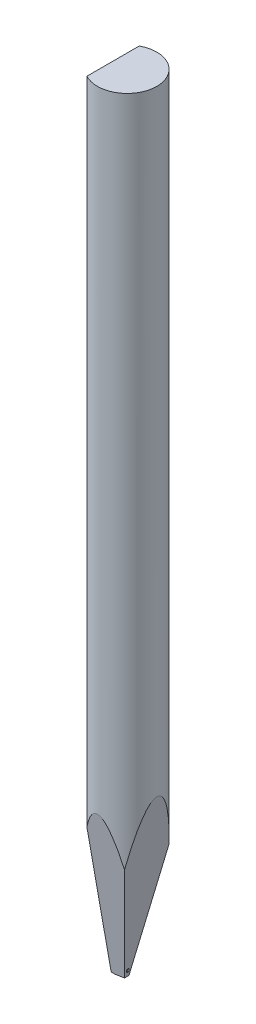
ISO-10303-21;
HEADER;
FILE_DESCRIPTION(('STEP AP214'),'2;1');
FILE_NAME('part.step','',(''),(''),'','','');
FILE_SCHEMA(('AUTOMOTIVE_DESIGN { 1 0 10303 214 1 1 1 1 }'));
ENDSEC;
DATA;
#1=APPLICATION_CONTEXT('core data for automotive mechanical design processes');
#2=APPLICATION_PROTOCOL_DEFINITION('international standard','automotive_design',2000,#1);
#3=PRODUCT_CONTEXT('',#1,'mechanical');
#4=PRODUCT('Part','Part','',(#3));
#5=PRODUCT_RELATED_PRODUCT_CATEGORY('part','',(#4));
#6=PRODUCT_DEFINITION_FORMATION('','',#4);
#7=PRODUCT_DEFINITION_CONTEXT('part definition',#1,'design');
#8=PRODUCT_DEFINITION('design','',#6,#7);
#9=PRODUCT_DEFINITION_SHAPE('','',#8);
#10=(LENGTH_UNIT() NAMED_UNIT(*) SI_UNIT(.MILLI.,.METRE.));
#11=(NAMED_UNIT(*) PLANE_ANGLE_UNIT() SI_UNIT($,.RADIAN.));
#12=(NAMED_UNIT(*) SI_UNIT($,.STERADIAN.) SOLID_ANGLE_UNIT());
#13=UNCERTAINTY_MEASURE_WITH_UNIT(LENGTH_MEASURE(1.E-05),#10,'distance_accuracy_value','');
#14=(GEOMETRIC_REPRESENTATION_CONTEXT(3) GLOBAL_UNCERTAINTY_ASSIGNED_CONTEXT((#13)) GLOBAL_UNIT_ASSIGNED_CONTEXT((#10,
#11,#12)) REPRESENTATION_CONTEXT('',''));
#15=CARTESIAN_POINT('',(0.,0.,0.));
#16=DIRECTION('',(0.,0.,1.));
#17=DIRECTION('',(1.,0.,0.));
#18=AXIS2_PLACEMENT_3D('',#15,#16,#17);
#19=CARTESIAN_POINT('',(26.8738719491216,0.,0.0508));
#20=DIRECTION('',(0.,-0.173648177666931,0.984807753012208));
#21=DIRECTION('',(0.,-0.984807753012208,-0.173648177666931));
#22=AXIS2_PLACEMENT_3D('',#19,#20,#21);
#23=PLANE('',#22);
#24=CARTESIAN_POINT('',(-0.34798,0.02794,0.0557265758409954));
#25=DIRECTION('',(0.,-0.173648177666931,0.984807753012208));
#26=DIRECTION('',(0.,-0.984807753012208,-0.173648177666931));
#27=AXIS2_PLACEMENT_3D('',#24,#25,#26);
#28=ELLIPSE('',#27,0.0283710195360877,0.02794);
#29=CARTESIAN_POINT('',(-0.34798,0.,0.0508000000000009));
#30=VERTEX_POINT('',#29);
#31=CARTESIAN_POINT('',(-0.37592,0.02794,0.0557265758409954));
#32=VERTEX_POINT('',#31);
#33=EDGE_CURVE('E78',#30,#32,#28,.F.);
#34=ORIENTED_EDGE('',*,*,#33,.F.);
#35=DIRECTION('',(-1.,0.,0.));
#36=VECTOR('',#35,1.);
#37=CARTESIAN_POINT('',(26.8738719491216,0.,0.0508));
#38=LINE('',#37,#36);
#39=CARTESIAN_POINT('',(-0.287019999999997,0.,0.0508));
#40=VERTEX_POINT('',#39);
#41=EDGE_CURVE('E485',#40,#30,#38,.T.);
#42=ORIENTED_EDGE('',*,*,#41,.F.);
#43=DIRECTION('',(-0.984346441568213,-0.173566836012845,-0.0306045161452665));
#44=VECTOR('',#43,1.);
#45=CARTESIAN_POINT('',(26.0301980698046,4.64043560289492,0.869033999030531));
#46=LINE('',#45,#44);
#47=CARTESIAN_POINT('',(-0.0117618940403387,0.0485354307393987,0.0593581059596632));
#48=VERTEX_POINT('',#47);
#49=EDGE_CURVE('E406',#48,#40,#46,.T.);
#50=ORIENTED_EDGE('',*,*,#49,.F.);
#51=DIRECTION('',(-0.171087869746036,-0.970287525247814,-0.171087869746036));
#52=VECTOR('',#51,1.);
#53=CARTESIAN_POINT('',(0.766901483986011,4.46455489014234,0.838021483986016));
#54=LINE('',#53,#52);
#55=CARTESIAN_POINT('',(0.523678555180163,3.08516911589156,0.594798555180167));
#56=VERTEX_POINT('',#55);
#57=EDGE_CURVE('E487',#56,#48,#54,.T.);
#58=ORIENTED_EDGE('',*,*,#57,.F.);
#59=CARTESIAN_POINT('',(0.,-0.288101116436578,0.));
#60=DIRECTION('',(0.,-0.173648177666931,0.984807753012208));
#61=DIRECTION('',(0.,-0.984807753012208,-0.173648177666931));
#62=AXIS2_PLACEMENT_3D('',#59,#60,#61);
#63=ELLIPSE('',#62,4.56371043248163,0.792479999999998);
#64=CARTESIAN_POINT('',(-0.37592,3.66844093071415,0.69764511322018));
#65=VERTEX_POINT('',#64);
#66=EDGE_CURVE('E480',#56,#65,#63,.T.);
#67=ORIENTED_EDGE('',*,*,#66,.T.);
#68=DIRECTION('',(0.,0.984807753012208,0.173648177666931));
#69=VECTOR('',#68,1.);
#70=CARTESIAN_POINT('',(-0.37592,20.251112252608,3.62161747949059));
#71=LINE('',#70,#69);
#72=EDGE_CURVE('E467',#32,#65,#71,.T.);
#73=ORIENTED_EDGE('',*,*,#72,.F.);
#74=EDGE_LOOP('',(#34,#42,#50,#58,#67,#73));
#75=FACE_BOUND('',#74,.T.);
#76=ADVANCED_FACE('F46',(#75),#23,.T.);
#77=CARTESIAN_POINT('',(26.8738719491216,0.,-0.0508));
#78=DIRECTION('',(0.,-0.173648177666931,-0.984807753012208));
#79=DIRECTION('',(0.,0.984807753012208,-0.173648177666931));
#80=AXIS2_PLACEMENT_3D('',#77,#78,#79);
#81=PLANE('',#80);
#82=CARTESIAN_POINT('',(-0.34798,0.02794,-0.0557265758409954));
#83=DIRECTION('',(0.,-0.173648177666931,-0.984807753012208));
#84=DIRECTION('',(0.,0.984807753012208,-0.173648177666931));
#85=AXIS2_PLACEMENT_3D('',#82,#83,#84);
#86=ELLIPSE('',#85,0.0283710195360877,0.02794);
#87=CARTESIAN_POINT('',(-0.37592,0.02794,-0.0557265758409954));
#88=VERTEX_POINT('',#87);
#89=CARTESIAN_POINT('',(-0.34798,0.,-0.0508000000000009));
#90=VERTEX_POINT('',#89);
#91=EDGE_CURVE('E444',#88,#90,#86,.F.);
#92=ORIENTED_EDGE('',*,*,#91,.F.);
#93=DIRECTION('',(0.,-0.984807753012208,0.173648177666931));
#94=VECTOR('',#93,1.);
#95=CARTESIAN_POINT('',(-0.37592,20.5255765703836,-3.67001294395617));
#96=LINE('',#95,#94);
#97=CARTESIAN_POINT('',(-0.37592,3.66844093071414,-0.69764511322018));
#98=VERTEX_POINT('',#97);
#99=EDGE_CURVE('E368',#98,#88,#96,.T.);
#100=ORIENTED_EDGE('',*,*,#99,.F.);
#101=CARTESIAN_POINT('',(0.,-0.288101116436578,0.));
#102=DIRECTION('',(0.,-0.173648177666931,-0.984807753012208));
#103=DIRECTION('',(0.,-0.984807753012208,0.173648177666931));
#104=AXIS2_PLACEMENT_3D('',#101,#102,#103);
#105=ELLIPSE('',#104,4.56371043248163,0.792479999999998);
#106=CARTESIAN_POINT('',(0.523678555180163,3.08516911589156,-0.594798555180167));
#107=VERTEX_POINT('',#106);
#108=EDGE_CURVE('E478',#98,#107,#105,.T.);
#109=ORIENTED_EDGE('',*,*,#108,.T.);
#110=DIRECTION('',(0.171087869746036,0.970287525247814,-0.171087869746036));
#111=VECTOR('',#110,1.);
#112=CARTESIAN_POINT('',(0.766901483986011,4.46455489014234,-0.838021483986016));
#113=LINE('',#112,#111);
#114=CARTESIAN_POINT('',(-0.0117618940403387,0.0485354307393987,-0.0593581059596632));
#115=VERTEX_POINT('',#114);
#116=EDGE_CURVE('E362',#115,#107,#113,.T.);
#117=ORIENTED_EDGE('',*,*,#116,.F.);
#118=DIRECTION('',(0.984346441568213,0.173566836012845,-0.0306045161452665));
#119=VECTOR('',#118,1.);
#120=CARTESIAN_POINT('',(26.0301980698046,4.64043560289492,-0.869033999030531));
#121=LINE('',#120,#119);
#122=CARTESIAN_POINT('',(-0.287019999999997,0.,-0.0508));
#123=VERTEX_POINT('',#122);
#124=EDGE_CURVE('E359',#123,#115,#121,.T.);
#125=ORIENTED_EDGE('',*,*,#124,.F.);
#126=DIRECTION('',(-1.,0.,0.));
#127=VECTOR('',#126,1.);
#128=CARTESIAN_POINT('',(26.8738719491216,0.,-0.0508));
#129=LINE('',#128,#127);
#130=EDGE_CURVE('E483',#123,#90,#129,.T.);
#131=ORIENTED_EDGE('',*,*,#130,.T.);
#132=EDGE_LOOP('',(#92,#100,#109,#117,#125,#131));
#133=FACE_BOUND('',#132,.T.);
#134=ADVANCED_FACE('F495',(#133),#81,.T.);
#135=CARTESIAN_POINT('',(0.,0.,0.));
#136=DIRECTION('',(0.,1.,0.));
#137=DIRECTION('',(0.,0.,1.));
#138=AXIS2_PLACEMENT_3D('',#135,#136,#137);
#139=PLANE('',#138);
#140=ORIENTED_EDGE('',*,*,#41,.T.);
#141=DIRECTION('',(0.,0.,-1.));
#142=VECTOR('',#141,1.);
#143=CARTESIAN_POINT('',(-0.34798,0.,26.4742862357989));
#144=LINE('',#143,#142);
#145=CARTESIAN_POINT('',(-0.347980000000001,0.,0.0279445807869608));
#146=VERTEX_POINT('',#145);
#147=EDGE_CURVE('E191',#30,#146,#144,.T.);
#148=ORIENTED_EDGE('',*,*,#147,.T.);
#149=DIRECTION('',(-1.,0.,0.));
#150=VECTOR('',#149,1.);
#151=CARTESIAN_POINT('',(26.7627469491216,0.,0.0279445807869608));
#152=LINE('',#151,#150);
#153=CARTESIAN_POINT('',(-0.287346115943936,0.000172120518164335,0.027187177847314));
#154=VERTEX_POINT('',#153);
#155=EDGE_CURVE('E188',#154,#146,#152,.T.);
#156=ORIENTED_EDGE('',*,*,#155,.F.);
#157=DIRECTION('',(0.,0.,-1.));
#158=VECTOR('',#157,1.);
#159=CARTESIAN_POINT('',(-0.28702,0.,27.2760283406468));
#160=LINE('',#159,#158);
#161=EDGE_CURVE('E391',#40,#154,#160,.T.);
#162=ORIENTED_EDGE('',*,*,#161,.F.);
#163=EDGE_LOOP('',(#140,#148,#156,#162));
#164=FACE_BOUND('',#163,.T.);
#165=ADVANCED_FACE('F404',(#164),#139,.F.);
#166=DIRECTION('',(-1.,0.,0.));
#167=VECTOR('',#166,1.);
#168=CARTESIAN_POINT('',(26.7627469491216,0.,-0.0279445807869607));
#169=LINE('',#168,#167);
#170=CARTESIAN_POINT('',(-0.287344442826813,0.000170388616115332,-0.0271950816037738));
#171=VERTEX_POINT('',#170);
#172=CARTESIAN_POINT('',(-0.347980000000001,0.,-0.0279445807869607));
#173=VERTEX_POINT('',#172);
#174=EDGE_CURVE('E382',#171,#173,#169,.T.);
#175=ORIENTED_EDGE('',*,*,#174,.T.);
#176=EDGE_CURVE('E451',#173,#90,#144,.T.);
#177=ORIENTED_EDGE('',*,*,#176,.T.);
#178=ORIENTED_EDGE('',*,*,#130,.F.);
#179=EDGE_CURVE('E388',#171,#123,#160,.T.);
#180=ORIENTED_EDGE('',*,*,#179,.F.);
#181=EDGE_LOOP('',(#175,#177,#178,#180));
#182=FACE_BOUND('',#181,.T.);
#183=ADVANCED_FACE('F449',(#182),#139,.F.);
#184=CARTESIAN_POINT('',(0.,21.0312,0.));
#185=DIRECTION('',(0.,-1.,0.));
#186=DIRECTION('',(0.,0.,-1.));
#187=AXIS2_PLACEMENT_3D('',#184,#185,#186);
#188=CYLINDRICAL_SURFACE('',#187,0.792479999999998);
#189=ORIENTED_EDGE('',*,*,#66,.F.);
#190=CARTESIAN_POINT('',(0.,0.115240446574634,0.));
#191=DIRECTION('',(-0.984807753012208,0.173648177666931,0.));
#192=DIRECTION('',(-0.173648177666931,-0.984807753012208,0.));
#193=AXIS2_PLACEMENT_3D('',#190,#191,#192);
#194=ELLIPSE('',#193,4.56371043248165,0.792479999999998);
#195=EDGE_CURVE('E397',#56,#107,#194,.T.);
#196=ORIENTED_EDGE('',*,*,#195,.T.);
#197=ORIENTED_EDGE('',*,*,#108,.F.);
#198=DIRECTION('',(0.,-1.,0.));
#199=VECTOR('',#198,1.);
#200=CARTESIAN_POINT('',(-0.37592,21.0312,-0.69764511322018));
#201=LINE('',#200,#199);
#202=CARTESIAN_POINT('',(-0.37592,21.0312,-0.69764511322018));
#203=VERTEX_POINT('',#202);
#204=EDGE_CURVE('E464',#203,#98,#201,.T.);
#205=ORIENTED_EDGE('',*,*,#204,.F.);
#206=CARTESIAN_POINT('',(0.,21.0312,0.));
#207=DIRECTION('',(0.,1.,0.));
#208=DIRECTION('',(0.,0.,1.));
#209=AXIS2_PLACEMENT_3D('',#206,#207,#208);
#210=CIRCLE('',#209,0.792479999999998);
#211=CARTESIAN_POINT('',(-0.37592,21.0312,0.69764511322018));
#212=VERTEX_POINT('',#211);
#213=EDGE_CURVE('E468',#212,#203,#210,.T.);
#214=ORIENTED_EDGE('',*,*,#213,.F.);
#215=DIRECTION('',(0.,-1.,0.));
#216=VECTOR('',#215,1.);
#217=CARTESIAN_POINT('',(-0.37592,21.0312,0.69764511322018));
#218=LINE('',#217,#216);
#219=EDGE_CURVE('E474',#65,#212,#218,.F.);
#220=ORIENTED_EDGE('',*,*,#219,.F.);
#221=EDGE_LOOP('',(#189,#196,#197,#205,#214,#220));
#222=FACE_BOUND('',#221,.T.);
#223=ADVANCED_FACE('F306',(#222),#188,.T.);
#224=CARTESIAN_POINT('',(-0.37592,21.0312,-0.80247998));
#225=DIRECTION('',(-1.,0.,0.));
#226=DIRECTION('',(0.,0.,1.));
#227=AXIS2_PLACEMENT_3D('',#224,#225,#226);
#228=PLANE('',#227);
#229=DIRECTION('',(0.,0.,-1.));
#230=VECTOR('',#229,1.);
#231=CARTESIAN_POINT('',(-0.37592,0.02794,26.4742862357989));
#232=LINE('',#231,#230);
#233=CARTESIAN_POINT('',(-0.37592,0.0279425976419618,0.000819623696634939));
#234=VERTEX_POINT('',#233);
#235=EDGE_CURVE('E71',#32,#234,#232,.T.);
#236=ORIENTED_EDGE('',*,*,#235,.F.);
#237=ORIENTED_EDGE('',*,*,#72,.T.);
#238=ORIENTED_EDGE('',*,*,#219,.T.);
#239=DIRECTION('',(0.,0.,-1.));
#240=VECTOR('',#239,1.);
#241=CARTESIAN_POINT('',(-0.37592,21.0312,-0.80247998));
#242=LINE('',#241,#240);
#243=EDGE_CURVE('E476',#212,#203,#242,.T.);
#244=ORIENTED_EDGE('',*,*,#243,.T.);
#245=ORIENTED_EDGE('',*,*,#204,.T.);
#246=ORIENTED_EDGE('',*,*,#99,.T.);
#247=EDGE_CURVE('E454',#234,#88,#232,.T.);
#248=ORIENTED_EDGE('',*,*,#247,.F.);
#249=EDGE_LOOP('',(#236,#237,#238,#244,#245,#246,#248));
#250=FACE_BOUND('',#249,.T.);
#251=ADVANCED_FACE('F461',(#250),#228,.T.);
#252=CARTESIAN_POINT('',(0.,21.0312,0.));
#253=DIRECTION('',(0.,1.,0.));
#254=DIRECTION('',(0.,0.,1.));
#255=AXIS2_PLACEMENT_3D('',#252,#253,#254);
#256=PLANE('',#255);
#257=ORIENTED_EDGE('',*,*,#213,.T.);
#258=ORIENTED_EDGE('',*,*,#243,.F.);
#259=EDGE_LOOP('',(#257,#258));
#260=FACE_BOUND('',#259,.T.);
#261=ADVANCED_FACE('F268',(#260),#256,.T.);
#262=CARTESIAN_POINT('',(-0.28702,0.,27.2760283406468));
#263=DIRECTION('',(-0.173648177666931,0.984807753012208,0.));
#264=DIRECTION('',(-0.984807753012208,-0.173648177666931,0.));
#265=AXIS2_PLACEMENT_3D('',#262,#263,#264);
#266=PLANE('',#265);
#267=CARTESIAN_POINT('',(-0.283960077964881,0.0005395468136565,0.0253794004304087));
#268=CARTESIAN_POINT('',(-0.290959888306957,-0.000403878190724749,0.0301014513274831));
#269=CARTESIAN_POINT('',(-0.301183512125918,-0.000354477550686594,0.029931369963511));
#270=CARTESIAN_POINT('',(-0.318739741346951,0.00159087096165506,0.0200336604158991));
#271=CARTESIAN_POINT('',(-0.325348851695025,0.0030571005873994,0.0101243519931192));
#272=CARTESIAN_POINT('',(-0.325298447967635,0.00304290082609972,-0.0103044348000937));
#273=CARTESIAN_POINT('',(-0.318650802822014,0.00156884374670576,-0.0201631568321128));
#274=CARTESIAN_POINT('',(-0.301094902380228,-0.000366386528997244,-0.0299742282026066));
#275=CARTESIAN_POINT('',(-0.290914989366692,-0.000402303153274816,-0.0300935679165402));
#276=CARTESIAN_POINT('',(-0.283960077964888,0.000539546813656544,-0.0253794004304084));
#277=(BOUNDED_CURVE() B_SPLINE_CURVE(3,(#267,#268,#269,#270,#271,#272,#273,#274,#275,#276),
.UNSPECIFIED.,.F.,.F.) B_SPLINE_CURVE_WITH_KNOTS((4,2,2,2,4),(1.16654008179031E-06,
2.15136488565191E-05,4.18607576312478E-05,6.22078664059766E-05,8.25549751807053E-05),
.UNSPECIFIED.) CURVE() GEOMETRIC_REPRESENTATION_ITEM() RATIONAL_B_SPLINE_CURVE((1.,1.,1.,1.,1.,
1.,1.,1.,1.,1.)) REPRESENTATION_ITEM(''));
#278=CARTESIAN_POINT('',(-0.283960077964881,0.00053954681365645,0.0253794004304088));
#279=VERTEX_POINT('',#278);
#280=EDGE_CURVE('E285',#154,#279,#277,.F.);
#281=ORIENTED_EDGE('',*,*,#280,.T.);
#282=CARTESIAN_POINT('',(-0.282645245708626,0.000771387215539414,0.));
#283=DIRECTION('',(-0.173648177666931,0.984807753012208,0.));
#284=DIRECTION('',(-0.984807753012208,-0.173648177666931,0.));
#285=AXIS2_PLACEMENT_3D('',#282,#283,#284);
#286=ELLIPSE('',#285,0.0331573451490401,0.0254);
#287=CARTESIAN_POINT('',(-0.282645245708626,0.000771387215539388,0.0253999999999992));
#288=VERTEX_POINT('',#287);
#289=EDGE_CURVE('E375',#279,#288,#286,.T.);
#290=ORIENTED_EDGE('',*,*,#289,.T.);
#291=DIRECTION('',(-0.984807753012208,-0.173648177666931,0.));
#292=VECTOR('',#291,1.);
#293=CARTESIAN_POINT('',(-0.28702,0.,0.0253999999999983));
#294=LINE('',#293,#292);
#295=CARTESIAN_POINT('',(-0.13462,0.0268722318599702,0.0253999999999992));
#296=VERTEX_POINT('',#295);
#297=EDGE_CURVE('E380',#296,#288,#294,.T.);
#298=ORIENTED_EDGE('',*,*,#297,.F.);
#299=DIRECTION('',(0.,0.,1.));
#300=VECTOR('',#299,1.);
#301=CARTESIAN_POINT('',(-0.13462,0.0268722318599702,27.2760283406468));
#302=LINE('',#301,#300);
#303=CARTESIAN_POINT('',(-0.13462,0.0268722318599702,-0.0253999999999992));
#304=VERTEX_POINT('',#303);
#305=EDGE_CURVE('E378',#304,#296,#302,.T.);
#306=ORIENTED_EDGE('',*,*,#305,.F.);
#307=DIRECTION('',(-0.984807753012208,-0.173648177666931,0.));
#308=VECTOR('',#307,1.);
#309=CARTESIAN_POINT('',(-0.28702,0.,-0.0253999999999983));
#310=LINE('',#309,#308);
#311=CARTESIAN_POINT('',(-0.282645245708626,0.000771387215539421,-0.0253999999999992));
#312=VERTEX_POINT('',#311);
#313=EDGE_CURVE('E360',#304,#312,#310,.T.);
#314=ORIENTED_EDGE('',*,*,#313,.T.);
#315=CARTESIAN_POINT('',(-0.283960077964881,0.000539546813656452,-0.0253794004304088));
#316=VERTEX_POINT('',#315);
#317=EDGE_CURVE('E408',#312,#316,#286,.T.);
#318=ORIENTED_EDGE('',*,*,#317,.T.);
#319=CARTESIAN_POINT('',(-0.283960077964881,0.0005395468136565,0.0253794004304087));
#320=CARTESIAN_POINT('',(-0.290959888306957,-0.000403878190724749,0.0301014513274831));
#321=CARTESIAN_POINT('',(-0.301183512125918,-0.000354477550686594,0.029931369963511));
#322=CARTESIAN_POINT('',(-0.318739741346951,0.00159087096165506,0.0200336604158991));
#323=CARTESIAN_POINT('',(-0.325348851695025,0.0030571005873994,0.0101243519931192));
#324=CARTESIAN_POINT('',(-0.325298447967635,0.00304290082609972,-0.0103044348000937));
#325=CARTESIAN_POINT('',(-0.318650802822014,0.00156884374670576,-0.0201631568321128));
#326=CARTESIAN_POINT('',(-0.301094902380228,-0.000366386528997244,-0.0299742282026066));
#327=CARTESIAN_POINT('',(-0.290914989366692,-0.000402303153274816,-0.0300935679165402));
#328=CARTESIAN_POINT('',(-0.283960077964888,0.000539546813656544,-0.0253794004304084));
#329=(BOUNDED_CURVE() B_SPLINE_CURVE(3,(#319,#320,#321,#322,#323,#324,#325,#326,#327,#328),
.UNSPECIFIED.,.F.,.F.) B_SPLINE_CURVE_WITH_KNOTS((4,2,2,2,4),(1.16654008179031E-06,
2.15136488565191E-05,4.18607576312478E-05,6.22078664059766E-05,8.25549751807053E-05),
.UNSPECIFIED.) CURVE() GEOMETRIC_REPRESENTATION_ITEM() RATIONAL_B_SPLINE_CURVE((1.,1.,1.,1.,1.,
1.,1.,1.,1.,1.)) REPRESENTATION_ITEM(''));
#330=EDGE_CURVE('E355',#316,#171,#329,.F.);
#331=ORIENTED_EDGE('',*,*,#330,.T.);
#332=ORIENTED_EDGE('',*,*,#179,.T.);
#333=ORIENTED_EDGE('',*,*,#124,.T.);
#334=DIRECTION('',(0.,0.,-1.));
#335=VECTOR('',#334,1.);
#336=CARTESIAN_POINT('',(-0.0117618940403371,0.0485354307393984,27.2760283406468));
#337=LINE('',#336,#335);
#338=EDGE_CURVE('E385',#48,#115,#337,.T.);
#339=ORIENTED_EDGE('',*,*,#338,.F.);
#340=ORIENTED_EDGE('',*,*,#49,.T.);
#341=ORIENTED_EDGE('',*,*,#161,.T.);
#342=EDGE_LOOP('',(#281,#290,#298,#306,#314,#318,#331,#332,#333,#339,#340,#341));
#343=FACE_BOUND('',#342,.T.);
#344=ADVANCED_FACE('F259',(#343),#266,.F.);
#345=CARTESIAN_POINT('',(-0.0117618940403371,0.0485354307393984,27.2760283406468));
#346=DIRECTION('',(-0.984807753012208,0.173648177666931,0.));
#347=DIRECTION('',(-0.173648177666931,-0.984807753012208,0.));
#348=AXIS2_PLACEMENT_3D('',#345,#346,#347);
#349=PLANE('',#348);
#350=CARTESIAN_POINT('',(0.0156928323063151,0.204238921131746,0.));
#351=DIRECTION('',(-0.984807753012208,0.173648177666931,0.));
#352=DIRECTION('',(0.173648177666931,0.984807753012208,0.));
#353=AXIS2_PLACEMENT_3D('',#350,#351,#352);
#354=ELLIPSE('',#353,0.0515734368592616,0.0370444608655554);
#355=CARTESIAN_POINT('',(0.0246484656329464,0.255028841600233,0.));
#356=VERTEX_POINT('',#355);
#357=EDGE_CURVE('E372',#356,#356,#354,.F.);
#358=ORIENTED_EDGE('',*,*,#357,.F.);
#359=EDGE_LOOP('',(#358));
#360=FACE_BOUND('',#359,.T.);
#361=ORIENTED_EDGE('',*,*,#195,.F.);
#362=ORIENTED_EDGE('',*,*,#57,.T.);
#363=ORIENTED_EDGE('',*,*,#338,.T.);
#364=ORIENTED_EDGE('',*,*,#116,.T.);
#365=EDGE_LOOP('',(#361,#362,#363,#364));
#366=FACE_BOUND('',#365,.T.);
#367=ADVANCED_FACE('F225',(#360,#366),#349,.F.);
#368=CARTESIAN_POINT('',(26.7627469491216,-0.126489968,0.));
#369=DIRECTION('',(-1.,0.,0.));
#370=DIRECTION('',(0.,0.,1.));
#371=AXIS2_PLACEMENT_3D('',#368,#369,#370);
#372=CYLINDRICAL_SURFACE('',#371,0.12954);
#373=ORIENTED_EDGE('',*,*,#155,.T.);
#374=CARTESIAN_POINT('',(-0.34798,0.,0.0279445807869606));
#375=CARTESIAN_POINT('',(-0.348349091560137,-2.4373302072914E-07,0.0279454827250861));
#376=CARTESIAN_POINT('',(-0.348716992702763,7.30455545849744E-06,0.027911524894726));
#377=CARTESIAN_POINT('',(-0.349437311610174,3.57943309148719E-05,0.0277821927914644));
#378=CARTESIAN_POINT('',(-0.349789854795058,5.65882766986827E-05,0.0276874950113475));
#379=CARTESIAN_POINT('',(-0.350551541254243,0.000115384443904732,0.0274174753498539));
#380=CARTESIAN_POINT('',(-0.350955676433414,0.000156197752376119,0.0272288462403929));
#381=CARTESIAN_POINT('',(-0.351728442445497,0.000249838675001402,0.0267896265213341));
#382=CARTESIAN_POINT('',(-0.352096906430402,0.000302719198042446,0.0265387626071171));
#383=CARTESIAN_POINT('',(-0.352987990871671,0.000446986634364566,0.0258419279073664));
#384=CARTESIAN_POINT('',(-0.35348475176395,0.000543619231949299,0.0253642738293868));
#385=CARTESIAN_POINT('',(-0.354400138333894,0.00074360279413547,0.0243414479839429));
#386=CARTESIAN_POINT('',(-0.354818597467352,0.000846967462366163,0.0237961363156788));
#387=CARTESIAN_POINT('',(-0.355929384345129,0.00114406583280984,0.0221657254862628));
#388=CARTESIAN_POINT('',(-0.356540781287296,0.0013376977161602,0.0210259820631102));
#389=CARTESIAN_POINT('',(-0.357601033668396,0.00170296073427158,0.0186716471645337));
#390=CARTESIAN_POINT('',(-0.358049459785676,0.00187453299982006,0.0174568677158935));
#391=CARTESIAN_POINT('',(-0.359200026139001,0.00233800773549144,0.0137825108091964));
#392=CARTESIAN_POINT('',(-0.359724536071804,0.00258457419140596,0.0112617324972563));
#393=CARTESIAN_POINT('',(-0.360438707859998,0.00292899699416231,0.0061610587996901));
#394=CARTESIAN_POINT('',(-0.360627122142513,0.00302629909173391,0.00358097901665116));
#395=CARTESIAN_POINT('',(-0.360708928405687,0.00306784876787628,-0.00181521156565399));
#396=CARTESIAN_POINT('',(-0.360574527394296,0.00299768116722435,-0.00463186266368362));
#397=CARTESIAN_POINT('',(-0.359922127078579,0.0026774730585895,-0.0102002605533267));
#398=CARTESIAN_POINT('',(-0.35940661154199,0.00242859751127472,-0.0129523090918375));
#399=CARTESIAN_POINT('',(-0.358378032769804,0.00200579430050119,-0.0164362267516784));
#400=CARTESIAN_POINT('',(-0.358109729772692,0.00189902690428334,-0.017249220407543));
#401=CARTESIAN_POINT('',(-0.357509302574654,0.00167325976975904,-0.0188534584464148));
#402=CARTESIAN_POINT('',(-0.357176950463404,0.00155421707662395,-0.0196446132674766));
#403=CARTESIAN_POINT('',(-0.356340595598206,0.00127563253536291,-0.021390016707206));
#404=CARTESIAN_POINT('',(-0.355814429821229,0.00111358611675536,-0.0223334443990135));
#405=CARTESIAN_POINT('',(-0.354603803947176,0.000789252325048008,-0.0241124167776409));
#406=CARTESIAN_POINT('',(-0.35392048309961,0.000626974660981518,-0.0249486735063971));
#407=CARTESIAN_POINT('',(-0.35281996146287,0.000420593239898147,-0.025969486264748));
#408=CARTESIAN_POINT('',(-0.352489132408333,0.00036401176971145,-0.0262439796314585));
#409=CARTESIAN_POINT('',(-0.351791822054152,0.000258987609793047,-0.0267465626071259));
#410=CARTESIAN_POINT('',(-0.351425327200929,0.000210548033332652,-0.0269746344725773));
#411=CARTESIAN_POINT('',(-0.350653121584307,0.000125424000013267,-0.027371452843003));
#412=CARTESIAN_POINT('',(-0.350246941268389,8.89101653930784E-05,-0.0275393413503319));
#413=CARTESIAN_POINT('',(-0.349408972561741,3.34478546745724E-05,-0.0277930649446902));
#414=CARTESIAN_POINT('',(-0.348977292078239,1.44303146265653E-05,-0.0278792226936788));
#415=CARTESIAN_POINT('',(-0.348448630577627,3.76997817881845E-06,-0.0279275097565269));
#416=CARTESIAN_POINT('',(-0.348355005223824,2.35768920915158E-06,-0.0279339061279444));
#417=CARTESIAN_POINT('',(-0.348167600294475,4.74566344676837E-07,-0.0279424338228166));
#418=CARTESIAN_POINT('',(-0.348073820826224,3.23663282567614E-09,-0.0279445673924581));
#419=CARTESIAN_POINT('',(-0.34798,0.,-0.0279445807869634));
#420=B_SPLINE_CURVE_WITH_KNOTS('',3,(#374,#375,#376,#377,#378,#379,#380,#381,#382,#383,#384,
#385,#386,#387,#388,#389,#390,#391,#392,#393,#394,#395,#396,#397,#398,#399,#400,#401,#402,#403,
#404,#405,#406,#407,#408,#409,#410,#411,#412,#413,#414,#415,#416,#417,#418,#419),.UNSPECIFIED.,
.F.,.F.,(4,2,2,2,2,2,2,2,2,2,2,2,2,2,2,2,2,2,2,2,2,2,4),(0.,0.00110371371287312,
0.00219534333891931,0.00353146900358845,0.00487356949290073,0.0069494506178281,
0.00902969806785878,0.0129309924202898,0.0168424908877766,0.0245596001059434,0.032305295764015,
0.040741385586484,0.0491229757730261,0.0517092769992483,0.0543049570838417,0.0575728211295654,
0.0608177034752608,0.062115373680452,0.0634135389613502,0.0647295372738637,0.0660403183123416,
0.0663218213263228,0.0666031759695123),.UNSPECIFIED.);
#421=CARTESIAN_POINT('',(-0.358914115102945,0.00223515646610651,0.0145003624316561));
#422=VERTEX_POINT('',#421);
#423=EDGE_CURVE('E185',#146,#422,#420,.T.);
#424=ORIENTED_EDGE('',*,*,#423,.T.);
#425=CARTESIAN_POINT('',(-0.37592,0.,-0.0279445807869607));
#426=CARTESIAN_POINT('',(-0.363216539301398,0.00202422866464862,-0.0187819949901625));
#427=CARTESIAN_POINT('',(-0.35052,0.003050032,-0.00938782301598649));
#428=CARTESIAN_POINT('',(-0.35052,0.003050032,0.00938782301598651));
#429=CARTESIAN_POINT('',(-0.363216539301398,0.00202422866464862,0.0187819949901625));
#430=CARTESIAN_POINT('',(-0.37592,0.,0.0279445807869608));
#431=(BOUNDED_CURVE() B_SPLINE_CURVE(3,(#425,#426,#427,#428,#429,#430),.UNSPECIFIED.,.F.,
.F.) B_SPLINE_CURVE_WITH_KNOTS((4,2,4),(1.35336552004547,1.5707963267949,1.78822713354432),
.UNSPECIFIED.) CURVE() GEOMETRIC_REPRESENTATION_ITEM() RATIONAL_B_SPLINE_CURVE((1.,1.,1.,1.,1.,1.)) REPRESENTATION_ITEM(''));
#432=CARTESIAN_POINT('',(-0.358914102578962,0.00223515512276409,-0.0145003743672444));
#433=VERTEX_POINT('',#432);
#434=EDGE_CURVE('E173',#422,#433,#431,.F.);
#435=ORIENTED_EDGE('',*,*,#434,.T.);
#436=EDGE_CURVE('E190',#433,#173,#420,.T.);
#437=ORIENTED_EDGE('',*,*,#436,.T.);
#438=ORIENTED_EDGE('',*,*,#174,.F.);
#439=CARTESIAN_POINT('',(-0.283960077964881,0.0005395468136565,0.0253794004304087));
#440=CARTESIAN_POINT('',(-0.290959888306957,-0.000403878190724749,0.0301014513274831));
#441=CARTESIAN_POINT('',(-0.301183512125918,-0.000354477550686594,0.029931369963511));
#442=CARTESIAN_POINT('',(-0.318739741346951,0.00159087096165506,0.0200336604158991));
#443=CARTESIAN_POINT('',(-0.325348851695025,0.0030571005873994,0.0101243519931192));
#444=CARTESIAN_POINT('',(-0.325298447967635,0.00304290082609972,-0.0103044348000937));
#445=CARTESIAN_POINT('',(-0.318650802822014,0.00156884374670576,-0.0201631568321128));
#446=CARTESIAN_POINT('',(-0.301094902380228,-0.000366386528997244,-0.0299742282026066));
#447=CARTESIAN_POINT('',(-0.290914989366692,-0.000402303153274816,-0.0300935679165402));
#448=CARTESIAN_POINT('',(-0.283960077964888,0.000539546813656544,-0.0253794004304084));
#449=(BOUNDED_CURVE() B_SPLINE_CURVE(3,(#439,#440,#441,#442,#443,#444,#445,#446,#447,#448),
.UNSPECIFIED.,.F.,.F.) B_SPLINE_CURVE_WITH_KNOTS((4,2,2,2,4),(1.16654008179031E-06,
2.15136488565191E-05,4.18607576312478E-05,6.22078664059766E-05,8.25549751807053E-05),
.UNSPECIFIED.) CURVE() GEOMETRIC_REPRESENTATION_ITEM() RATIONAL_B_SPLINE_CURVE((1.,1.,1.,1.,1.,
1.,1.,1.,1.,1.)) REPRESENTATION_ITEM(''));
#450=EDGE_CURVE('E356',#171,#154,#449,.F.);
#451=ORIENTED_EDGE('',*,*,#450,.T.);
#452=EDGE_LOOP('',(#373,#424,#435,#437,#438,#451));
#453=FACE_BOUND('',#452,.T.);
#454=ADVANCED_FACE('F186',(#453),#372,.F.);
#455=CARTESIAN_POINT('',(-0.13462,0.1016,0.0254));
#456=DIRECTION('',(-1.,0.,0.));
#457=DIRECTION('',(0.,0.,1.));
#458=AXIS2_PLACEMENT_3D('',#455,#456,#457);
#459=PLANE('',#458);
#460=ORIENTED_EDGE('',*,*,#305,.T.);
#461=DIRECTION('',(0.,1.,0.));
#462=VECTOR('',#461,1.);
#463=CARTESIAN_POINT('',(-0.13462,0.1016,0.0254));
#464=LINE('',#463,#462);
#465=CARTESIAN_POINT('',(-0.13462,0.1016,0.0254));
#466=VERTEX_POINT('',#465);
#467=EDGE_CURVE('E432',#296,#466,#464,.T.);
#468=ORIENTED_EDGE('',*,*,#467,.T.);
#469=DIRECTION('',(0.,0.,-1.));
#470=VECTOR('',#469,1.);
#471=CARTESIAN_POINT('',(-0.13462,0.1016,0.0254));
#472=LINE('',#471,#470);
#473=CARTESIAN_POINT('',(-0.13462,0.1016,0.02286));
#474=VERTEX_POINT('',#473);
#475=EDGE_CURVE('E421',#466,#474,#472,.T.);
#476=ORIENTED_EDGE('',*,*,#475,.T.);
#477=CARTESIAN_POINT('',(-0.13462,0.1016,0.));
#478=DIRECTION('',(1.,0.,0.));
#479=DIRECTION('',(0.,1.,0.));
#480=AXIS2_PLACEMENT_3D('',#477,#478,#479);
#481=ELLIPSE('',#480,0.0263964543073496,0.02286);
#482=CARTESIAN_POINT('',(-0.13462,0.1016,-0.0228599999999995));
#483=VERTEX_POINT('',#482);
#484=EDGE_CURVE('E431',#483,#474,#481,.F.);
#485=ORIENTED_EDGE('',*,*,#484,.F.);
#486=CARTESIAN_POINT('',(-0.13462,0.1016,-0.0254));
#487=VERTEX_POINT('',#486);
#488=EDGE_CURVE('E424',#483,#487,#472,.T.);
#489=ORIENTED_EDGE('',*,*,#488,.T.);
#490=DIRECTION('',(0.,1.,0.));
#491=VECTOR('',#490,1.);
#492=CARTESIAN_POINT('',(-0.13462,0.1016,-0.0254));
#493=LINE('',#492,#491);
#494=EDGE_CURVE('E425',#304,#487,#493,.T.);
#495=ORIENTED_EDGE('',*,*,#494,.F.);
#496=EDGE_LOOP('',(#460,#468,#476,#485,#489,#495));
#497=FACE_BOUND('',#496,.T.);
#498=ADVANCED_FACE('F224',(#497),#459,.T.);
#499=CARTESIAN_POINT('',(0.,0.,0.0254));
#500=DIRECTION('',(0.,0.,-1.));
#501=DIRECTION('',(-1.,0.,0.));
#502=AXIS2_PLACEMENT_3D('',#499,#500,#501);
#503=PLANE('',#502);
#504=ORIENTED_EDGE('',*,*,#297,.T.);
#505=DIRECTION('',(-0.500000000000004,-0.866025403784436,0.));
#506=VECTOR('',#505,1.);
#507=CARTESIAN_POINT('',(-0.212317954743874,0.122581828325168,0.0254));
#508=LINE('',#507,#506);
#509=CARTESIAN_POINT('',(-0.2244318189755,0.1016,0.0254));
#510=VERTEX_POINT('',#509);
#511=EDGE_CURVE('E418',#510,#288,#508,.T.);
#512=ORIENTED_EDGE('',*,*,#511,.F.);
#513=DIRECTION('',(-1.,0.,0.));
#514=VECTOR('',#513,1.);
#515=CARTESIAN_POINT('',(-0.253761212650333,0.1016,0.0254));
#516=LINE('',#515,#514);
#517=EDGE_CURVE('E427',#466,#510,#516,.T.);
#518=ORIENTED_EDGE('',*,*,#517,.F.);
#519=ORIENTED_EDGE('',*,*,#467,.F.);
#520=EDGE_LOOP('',(#504,#512,#518,#519));
#521=FACE_BOUND('',#520,.T.);
#522=ADVANCED_FACE('F547',(#521),#503,.T.);
#523=CARTESIAN_POINT('',(0.,0.,-0.0254));
#524=DIRECTION('',(0.,0.,-1.));
#525=DIRECTION('',(-1.,0.,0.));
#526=AXIS2_PLACEMENT_3D('',#523,#524,#525);
#527=PLANE('',#526);
#528=ORIENTED_EDGE('',*,*,#494,.T.);
#529=DIRECTION('',(-1.,0.,0.));
#530=VECTOR('',#529,1.);
#531=CARTESIAN_POINT('',(-0.253761212650333,0.1016,-0.0254));
#532=LINE('',#531,#530);
#533=CARTESIAN_POINT('',(-0.2244318189755,0.1016,-0.0254));
#534=VERTEX_POINT('',#533);
#535=EDGE_CURVE('E428',#487,#534,#532,.T.);
#536=ORIENTED_EDGE('',*,*,#535,.T.);
#537=DIRECTION('',(0.500000000000004,0.866025403784436,0.));
#538=VECTOR('',#537,1.);
#539=CARTESIAN_POINT('',(-0.2244318189755,0.1016,-0.0254));
#540=LINE('',#539,#538);
#541=EDGE_CURVE('E416',#312,#534,#540,.T.);
#542=ORIENTED_EDGE('',*,*,#541,.F.);
#543=ORIENTED_EDGE('',*,*,#313,.F.);
#544=EDGE_LOOP('',(#528,#536,#542,#543));
#545=FACE_BOUND('',#544,.T.);
#546=ADVANCED_FACE('F554',(#545),#527,.F.);
#547=CARTESIAN_POINT('',(-0.0122476108639845,0.172251731809055,0.));
#548=DIRECTION('',(0.866025403784441,0.499999999999995,0.));
#549=DIRECTION('',(-0.499999999999995,0.866025403784441,0.));
#550=AXIS2_PLACEMENT_3D('',#547,#548,#549);
#551=CONICAL_SURFACE('',#550,0.02286,0.392699081698725);
#552=CARTESIAN_POINT('',(-0.0122476108639845,0.172251731809055,0.));
#553=DIRECTION('',(0.866025403784441,0.499999999999995,0.));
#554=DIRECTION('',(-0.499999999999995,0.866025403784441,0.));
#555=AXIS2_PLACEMENT_3D('',#552,#553,#554);
#556=CIRCLE('',#555,0.02286);
#557=CARTESIAN_POINT('',(-0.0236776108639844,0.192049072539568,0.));
#558=VERTEX_POINT('',#557);
#559=EDGE_CURVE('E441',#558,#558,#556,.T.);
#560=ORIENTED_EDGE('',*,*,#559,.F.);
#561=EDGE_LOOP('',(#560));
#562=FACE_BOUND('',#561,.T.);
#563=ORIENTED_EDGE('',*,*,#357,.T.);
#564=EDGE_LOOP('',(#563));
#565=FACE_BOUND('',#564,.T.);
#566=ADVANCED_FACE('F205',(#562,#565),#551,.F.);
#567=CARTESIAN_POINT('',(-0.2244318189755,0.1016,0.));
#568=DIRECTION('',(-0.500000000000004,-0.866025403784436,0.));
#569=DIRECTION('',(0.866025403784436,-0.500000000000004,0.));
#570=AXIS2_PLACEMENT_3D('',#567,#568,#569);
#571=CYLINDRICAL_SURFACE('',#570,0.0254);
#572=ORIENTED_EDGE('',*,*,#289,.F.);
#573=CARTESIAN_POINT('',(-0.283960077964888,0.000539546813656544,-0.0253794004304084));
#574=CARTESIAN_POINT('',(-0.290620470207567,0.00558515691162217,-0.0250452886328879));
#575=CARTESIAN_POINT('',(-0.29530865342746,0.00862485775711321,-0.0214849894949587));
#576=CARTESIAN_POINT('',(-0.301813256061598,0.0137805281930358,-0.012231218631275));
#577=CARTESIAN_POINT('',(-0.303312837197264,0.0157480460464886,-0.00616429254179718));
#578=CARTESIAN_POINT('',(-0.303340470817847,0.0157520001747071,0.00605659596115557));
#579=CARTESIAN_POINT('',(-0.301865656052902,0.0137850142842736,0.0121489075110776));
#580=CARTESIAN_POINT('',(-0.295372756896017,0.00862363859697051,0.0214513961082575));
#581=CARTESIAN_POINT('',(-0.290663895525867,0.00559321834085482,0.0250436106680499));
#582=CARTESIAN_POINT('',(-0.283960077964881,0.0005395468136565,0.0253794004304087));
#583=(BOUNDED_CURVE() B_SPLINE_CURVE(3,(#573,#574,#575,#576,#577,#578,#579,#580,#581,#582),
.UNSPECIFIED.,.F.,.F.) B_SPLINE_CURVE_WITH_KNOTS((4,2,2,2,4),(1.16654008179031E-06,
2.15136488565191E-05,4.18607576312478E-05,6.22078664059766E-05,8.25549751807053E-05),
.UNSPECIFIED.) CURVE() GEOMETRIC_REPRESENTATION_ITEM() RATIONAL_B_SPLINE_CURVE((1.,1.,1.,1.,1.,
1.,1.,1.,1.,1.)) REPRESENTATION_ITEM(''));
#584=EDGE_CURVE('E180',#279,#316,#583,.F.);
#585=ORIENTED_EDGE('',*,*,#584,.T.);
#586=ORIENTED_EDGE('',*,*,#317,.F.);
#587=ORIENTED_EDGE('',*,*,#541,.T.);
#588=CARTESIAN_POINT('',(-0.2244318189755,0.1016,0.));
#589=DIRECTION('',(0.,-1.,0.));
#590=DIRECTION('',(-1.,0.,0.));
#591=AXIS2_PLACEMENT_3D('',#588,#589,#590);
#592=ELLIPSE('',#591,0.0293293936748331,0.0254);
#593=EDGE_CURVE('E410',#534,#510,#592,.F.);
#594=ORIENTED_EDGE('',*,*,#593,.T.);
#595=ORIENTED_EDGE('',*,*,#511,.T.);
#596=EDGE_LOOP('',(#572,#585,#586,#587,#594,#595));
#597=FACE_BOUND('',#596,.T.);
#598=ADVANCED_FACE('F227',(#597),#571,.F.);
#599=CARTESIAN_POINT('',(-0.253761212650333,0.1016,0.0254));
#600=DIRECTION('',(0.,-1.,0.));
#601=DIRECTION('',(0.,0.,-1.));
#602=AXIS2_PLACEMENT_3D('',#599,#600,#601);
#603=PLANE('',#602);
#604=ORIENTED_EDGE('',*,*,#535,.F.);
#605=ORIENTED_EDGE('',*,*,#488,.F.);
#606=CARTESIAN_POINT('',(-0.13462,0.1016,0.));
#607=DIRECTION('',(0.,1.,0.));
#608=DIRECTION('',(1.,0.,0.));
#609=AXIS2_PLACEMENT_3D('',#606,#607,#608);
#610=ELLIPSE('',#609,0.0457200000000005,0.02286);
#611=EDGE_CURVE('E438',#474,#483,#610,.F.);
#612=ORIENTED_EDGE('',*,*,#611,.F.);
#613=ORIENTED_EDGE('',*,*,#475,.F.);
#614=ORIENTED_EDGE('',*,*,#517,.T.);
#615=ORIENTED_EDGE('',*,*,#593,.F.);
#616=EDGE_LOOP('',(#604,#605,#612,#613,#614,#615));
#617=FACE_BOUND('',#616,.T.);
#618=ADVANCED_FACE('F572',(#617),#603,.T.);
#619=CARTESIAN_POINT('',(-0.394589365329037,-0.0484933830537733,0.));
#620=DIRECTION('',(0.866025403784441,0.499999999999995,0.));
#621=DIRECTION('',(-0.499999999999995,0.866025403784441,0.));
#622=AXIS2_PLACEMENT_3D('',#619,#620,#621);
#623=CYLINDRICAL_SURFACE('',#622,0.02286);
#624=ORIENTED_EDGE('',*,*,#484,.T.);
#625=ORIENTED_EDGE('',*,*,#611,.T.);
#626=EDGE_LOOP('',(#624,#625));
#627=FACE_BOUND('',#626,.T.);
#628=ORIENTED_EDGE('',*,*,#559,.T.);
#629=EDGE_LOOP('',(#628));
#630=FACE_BOUND('',#629,.T.);
#631=ADVANCED_FACE('F304',(#627,#630),#623,.F.);
#632=CARTESIAN_POINT('',(-0.283960077964888,0.000539546813656544,-0.0253794004304084));
#633=CARTESIAN_POINT('',(-0.290914989366692,-0.000402303153274816,-0.0300935679165402));
#634=CARTESIAN_POINT('',(-0.301094902380228,-0.000366386528997244,-0.0299742282026066));
#635=CARTESIAN_POINT('',(-0.318650802822014,0.00156884374670576,-0.0201631568321128));
#636=CARTESIAN_POINT('',(-0.325298447967635,0.00304290082609972,-0.0103044348000937));
#637=CARTESIAN_POINT('',(-0.325348851695025,0.0030571005873994,0.0101243519931192));
#638=CARTESIAN_POINT('',(-0.318739741346951,0.00159087096165506,0.0200336604158991));
#639=CARTESIAN_POINT('',(-0.301183512125918,-0.000354477550686594,0.029931369963511));
#640=CARTESIAN_POINT('',(-0.290959888306957,-0.000403878190724749,0.0301014513274831));
#641=CARTESIAN_POINT('',(-0.283960077964881,0.0005395468136565,0.0253794004304087));
#642=CARTESIAN_POINT('',(-0.283960077964888,0.000539546813656544,-0.0253794004304084));
#643=CARTESIAN_POINT('',(-0.290034144592141,0.000583583146453238,-0.0251671898350692));
#644=CARTESIAN_POINT('',(-0.297077707466159,0.00125139098972531,-0.0231329045112122));
#645=CARTESIAN_POINT('',(-0.307463168145655,0.00255752122449897,-0.0138101461226542));
#646=CARTESIAN_POINT('',(-0.310641826829672,0.00304763555380532,-0.00687155761857581));
#647=CARTESIAN_POINT('',(-0.31067615014625,0.00305240766702202,0.00675173933928719));
#648=CARTESIAN_POINT('',(-0.307528281140424,0.00256644562734887,0.0137178576057902));
#649=CARTESIAN_POINT('',(-0.297151818927872,0.00125777479286239,0.023100211312403));
#650=CARTESIAN_POINT('',(-0.290078118998995,0.00058377277194386,0.0251662373975419));
#651=CARTESIAN_POINT('',(-0.283960077964881,0.0005395468136565,0.0253794004304087));
#652=CARTESIAN_POINT('',(-0.283960077964888,0.000539546813656544,-0.0253794004304084));
#653=CARTESIAN_POINT('',(-0.290620470207567,0.00558515691162217,-0.0250452886328879));
#654=CARTESIAN_POINT('',(-0.29530865342746,0.00862485775711321,-0.0214849894949587));
#655=CARTESIAN_POINT('',(-0.301813256061598,0.0137805281930358,-0.012231218631275));
#656=CARTESIAN_POINT('',(-0.303312837197264,0.0157480460464886,-0.00616429254179718));
#657=CARTESIAN_POINT('',(-0.303340470817847,0.0157520001747071,0.00605659596115557));
#658=CARTESIAN_POINT('',(-0.301865656052902,0.0137850142842736,0.0121489075110776));
#659=CARTESIAN_POINT('',(-0.295372756896017,0.00862363859697051,0.0214513961082575));
#660=CARTESIAN_POINT('',(-0.290663895525867,0.00559321834085482,0.0250436106680499));
#661=CARTESIAN_POINT('',(-0.283960077964881,0.0005395468136565,0.0253794004304087));
#662=(BOUNDED_SURFACE() B_SPLINE_SURFACE(2,3,((#632,#633,#634,#635,#636,#637,#638,#639,#640,
#641),(#642,#643,#644,#645,#646,#647,#648,#649,#650,#651),(#652,#653,#654,#655,#656,#657,#658,
#659,#660,#661)),.UNSPECIFIED.,.F.,.F.,.F.) B_SPLINE_SURFACE_WITH_KNOTS((3,3),(4,2,2,2,4),(0.,
1.),(1.16654008179031E-06,2.15136488565191E-05,4.18607576312478E-05,6.22078664059766E-05,
8.25549751807053E-05),
.UNSPECIFIED.) GEOMETRIC_REPRESENTATION_ITEM() RATIONAL_B_SPLINE_SURFACE(((1.,1.,1.,1.,1.,1.,1.,
1.,1.,1.),(0.77958430287966,0.841043129225897,0.858394467761886,0.870980000309769,
0.866040532086526,0.866010407805571,0.870956375403902,0.858509240043099,0.841292356013696,
0.779584302879625),(1.,1.,1.,1.,1.,1.,1.,1.,1.,1.))) REPRESENTATION_ITEM('') SURFACE());
#663=ORIENTED_EDGE('',*,*,#330,.F.);
#664=ORIENTED_EDGE('',*,*,#584,.F.);
#665=ORIENTED_EDGE('',*,*,#280,.F.);
#666=ORIENTED_EDGE('',*,*,#450,.F.);
#667=EDGE_LOOP('',(#663,#664,#665,#666));
#668=FACE_BOUND('',#667,.T.);
#669=ADVANCED_FACE('F292',(#668),#662,.T.);
#670=CARTESIAN_POINT('',(-0.37592,0.,0.0279445807869608));
#671=CARTESIAN_POINT('',(-0.363216539301398,0.00202422866464862,0.0187819949901625));
#672=CARTESIAN_POINT('',(-0.35052,0.003050032,0.00938782301598651));
#673=CARTESIAN_POINT('',(-0.35052,0.003050032,-0.00938782301598649));
#674=CARTESIAN_POINT('',(-0.363216539301398,0.00202422866464862,-0.0187819949901625));
#675=CARTESIAN_POINT('',(-0.37592,0.,-0.0279445807869607));
#676=CARTESIAN_POINT('',(-0.37592,0.,0.0279445807869608));
#677=CARTESIAN_POINT('',(-0.37591999999997,0.00202523829032043,0.0187774199570223));
#678=CARTESIAN_POINT('',(-0.375919999999999,0.00305003200000016,0.00938782301598647));
#679=CARTESIAN_POINT('',(-0.375919999999999,0.00305003200000016,-0.00938782301598648));
#680=CARTESIAN_POINT('',(-0.37591999999997,0.00202523829032078,-0.0187774199570222));
#681=CARTESIAN_POINT('',(-0.37592,0.,-0.0279445807869607));
#682=CARTESIAN_POINT('',(-0.37592,0.,0.0279445807869608));
#683=CARTESIAN_POINT('',(-0.37592,0.0143030999365062,0.0215785246774377));
#684=CARTESIAN_POINT('',(-0.37592,0.0284500319999992,0.0111983606559208));
#685=CARTESIAN_POINT('',(-0.37592,0.0284500319999992,-0.0111983606559208));
#686=CARTESIAN_POINT('',(-0.37592,0.0143030999365065,-0.0215785246774383));
#687=CARTESIAN_POINT('',(-0.37592,0.,-0.0279445807869607));
#688=(BOUNDED_SURFACE() B_SPLINE_SURFACE(2,3,((#670,#671,#672,#673,#674,#675),(#676,#677,#678,
#679,#680,#681),(#682,#683,#684,#685,#686,#687)),.UNSPECIFIED.,.F.,.F.,
.F.) B_SPLINE_SURFACE_WITH_KNOTS((3,3),(4,2,4),(0.,1.),(1.35336552004547,1.5707963267949,
1.78822713354432),.UNSPECIFIED.) GEOMETRIC_REPRESENTATION_ITEM() RATIONAL_B_SPLINE_SURFACE(((1.,
1.,1.,1.,1.,1.),(0.707106781186548,0.707106781186548,0.707106781186561,0.707106781186561,
0.707106781186548,0.707106781186548),(1.,1.,1.,1.,1.,1.))) REPRESENTATION_ITEM('') SURFACE());
#689=CARTESIAN_POINT('',(-0.358926296037376,0.00223353771796169,-0.0145125118697819));
#690=CARTESIAN_POINT('',(-0.359072555796365,0.00229485140364069,-0.013949900361827));
#691=CARTESIAN_POINT('',(-0.359309339118034,0.00239747447245167,-0.0134380440184734));
#692=CARTESIAN_POINT('',(-0.360014400979282,0.00272125378086248,-0.012329680167853));
#693=CARTESIAN_POINT('',(-0.360536390612073,0.00297258240652312,-0.0117745330721591));
#694=CARTESIAN_POINT('',(-0.362090368900087,0.00379818227440909,-0.0104272923925226));
#695=CARTESIAN_POINT('',(-0.363195177131805,0.00446968648625826,-0.00980314582879351));
#696=CARTESIAN_POINT('',(-0.366318695861826,0.00670894865374639,-0.00826316600913973));
#697=CARTESIAN_POINT('',(-0.368257249013209,0.00853713822374569,-0.00759637858482647));
#698=CARTESIAN_POINT('',(-0.371851523566927,0.0130833253250691,-0.00634607457398463));
#699=CARTESIAN_POINT('',(-0.373391370588262,0.015902753172496,-0.00579986140904587));
#700=CARTESIAN_POINT('',(-0.37516368076363,0.0210813864937863,-0.0048923602946109));
#701=CARTESIAN_POINT('',(-0.375637034210932,0.0233589768989004,-0.00452099659744501));
#702=CARTESIAN_POINT('',(-0.375888960981437,0.026413406780092,-0.00399166974493378));
#703=CARTESIAN_POINT('',(-0.375920388694305,0.0271773437670079,-0.00385669930496051));
#704=CARTESIAN_POINT('',(-0.37592,0.0279400000000001,-0.00371749590432352));
#705=B_SPLINE_CURVE_WITH_KNOTS('',3,(#689,#690,#691,#692,#693,#694,#695,#696,#697,#698,#699,
#700,#701,#702,#703,#704),.UNSPECIFIED.,.F.,.F.,(4,2,2,2,2,2,2,4),(0.,0.0017101325434373,
0.00406795210050592,0.00832000526764805,0.0164294400829493,0.0260163204461481,
0.0330116878793444,0.0353382877636078),.UNSPECIFIED.);
#706=EDGE_CURVE('E12',#433,#234,#705,.T.);
#707=CARTESIAN_POINT('',(-0.358926296037657,0.00223353771799824,0.0145125118700792));
#708=CARTESIAN_POINT('',(-0.359072555801279,0.00229485139438004,0.0139499003620389));
#709=CARTESIAN_POINT('',(-0.359309339121728,0.00239747446532576,0.0134380440185652));
#710=CARTESIAN_POINT('',(-0.360014400975176,0.00272125378881427,0.0123296801675583));
#711=CARTESIAN_POINT('',(-0.360536390599538,0.00297258243121093,0.0117745330716036));
#712=CARTESIAN_POINT('',(-0.362090368879792,0.00379818231480216,0.0104272923920407));
#713=CARTESIAN_POINT('',(-0.363195177125399,0.00446968650066125,0.00980314582835322));
#714=CARTESIAN_POINT('',(-0.366318695876229,0.00670894862784421,0.00826316600889903));
#715=CARTESIAN_POINT('',(-0.368257249016435,0.00853713821540783,0.00759637858507903));
#716=CARTESIAN_POINT('',(-0.371851523560731,0.0130833253316161,0.00634607457457498));
#717=CARTESIAN_POINT('',(-0.373391370586075,0.0159027531721987,0.00579986140950132));
#718=CARTESIAN_POINT('',(-0.375163680763323,0.021081386488437,0.00489236029525338));
#719=CARTESIAN_POINT('',(-0.37563703421009,0.023358976892997,0.0045209965983489));
#720=CARTESIAN_POINT('',(-0.375888960981176,0.0264134067754658,0.00399166974577517));
#721=CARTESIAN_POINT('',(-0.375920388694217,0.027177343764797,0.00385669930539841));
#722=CARTESIAN_POINT('',(-0.37592,0.0279400000000006,0.00371749590432914));
#723=B_SPLINE_CURVE_WITH_KNOTS('',3,(#707,#708,#709,#710,#711,#712,#713,#714,#715,#716,#717,
#718,#719,#720,#721,#722),.UNSPECIFIED.,.F.,.F.,(4,2,2,2,2,2,2,4),(0.,0.0017101325436439,
0.00406795210124181,0.00832000526595643,0.0164294400779638,0.0260163204411243,
0.0330116878696808,0.0353382877611676),.UNSPECIFIED.);
#724=EDGE_CURVE('E64',#234,#422,#723,.F.);
#725=ORIENTED_EDGE('',*,*,#706,.F.);
#726=ORIENTED_EDGE('',*,*,#434,.F.);
#727=ORIENTED_EDGE('',*,*,#724,.F.);
#728=EDGE_LOOP('',(#725,#726,#727));
#729=FACE_BOUND('',#728,.T.);
#730=ADVANCED_FACE('F49',(#729),#688,.T.);
#731=CARTESIAN_POINT('',(-0.34798,0.02794,26.4742862357989));
#732=DIRECTION('',(0.,0.,-1.));
#733=DIRECTION('',(-1.,0.,0.));
#734=AXIS2_PLACEMENT_3D('',#731,#732,#733);
#735=CYLINDRICAL_SURFACE('',#734,0.02794);
#736=ORIENTED_EDGE('',*,*,#147,.F.);
#737=ORIENTED_EDGE('',*,*,#33,.T.);
#738=ORIENTED_EDGE('',*,*,#235,.T.);
#739=ORIENTED_EDGE('',*,*,#724,.T.);
#740=ORIENTED_EDGE('',*,*,#423,.F.);
#741=EDGE_LOOP('',(#736,#737,#738,#739,#740));
#742=FACE_BOUND('',#741,.T.);
#743=ADVANCED_FACE('F193',(#742),#735,.T.);
#744=ORIENTED_EDGE('',*,*,#247,.T.);
#745=ORIENTED_EDGE('',*,*,#91,.T.);
#746=ORIENTED_EDGE('',*,*,#176,.F.);
#747=ORIENTED_EDGE('',*,*,#436,.F.);
#748=ORIENTED_EDGE('',*,*,#706,.T.);
#749=EDGE_LOOP('',(#744,#745,#746,#747,#748));
#750=FACE_BOUND('',#749,.T.);
#751=ADVANCED_FACE('F200',(#750),#735,.T.);
#752=CLOSED_SHELL('',(#76,#134,#165,#183,#223,#251,#261,#344,#367,#454,#498,#522,#546,#566,#598,
#618,#631,#669,#730,#743,#751));
#753=MANIFOLD_SOLID_BREP('B2',#752);
#754=ADVANCED_BREP_SHAPE_REPRESENTATION('',(#18,#753),#14);
#755=SHAPE_DEFINITION_REPRESENTATION(#9,#754);
ENDSEC;
END-ISO-10303-21;
